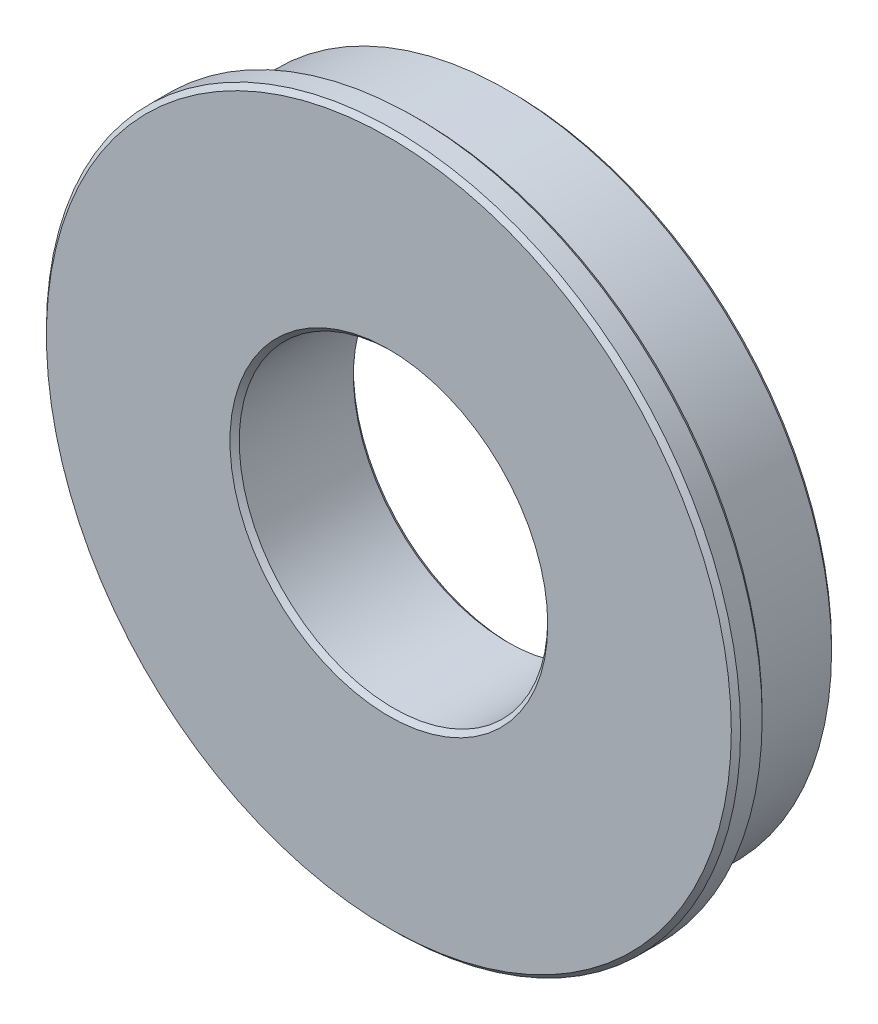
ISO-10303-21;
HEADER;
FILE_DESCRIPTION(('STEP AP214'),'2;1');
FILE_NAME('part.step','',(''),(''),'','','');
FILE_SCHEMA(('AUTOMOTIVE_DESIGN { 1 0 10303 214 1 1 1 1 }'));
ENDSEC;
DATA;
#1=APPLICATION_CONTEXT('core data for automotive mechanical design processes');
#2=APPLICATION_PROTOCOL_DEFINITION('international standard','automotive_design',2000,#1);
#3=PRODUCT_CONTEXT('',#1,'mechanical');
#4=PRODUCT('Part','Part','',(#3));
#5=PRODUCT_RELATED_PRODUCT_CATEGORY('part','',(#4));
#6=PRODUCT_DEFINITION_FORMATION('','',#4);
#7=PRODUCT_DEFINITION_CONTEXT('part definition',#1,'design');
#8=PRODUCT_DEFINITION('design','',#6,#7);
#9=PRODUCT_DEFINITION_SHAPE('','',#8);
#10=(LENGTH_UNIT() NAMED_UNIT(*) SI_UNIT(.MILLI.,.METRE.));
#11=(NAMED_UNIT(*) PLANE_ANGLE_UNIT() SI_UNIT($,.RADIAN.));
#12=(NAMED_UNIT(*) SI_UNIT($,.STERADIAN.) SOLID_ANGLE_UNIT());
#13=UNCERTAINTY_MEASURE_WITH_UNIT(LENGTH_MEASURE(1.E-05),#10,'distance_accuracy_value','');
#14=(GEOMETRIC_REPRESENTATION_CONTEXT(3) GLOBAL_UNCERTAINTY_ASSIGNED_CONTEXT((#13)) GLOBAL_UNIT_ASSIGNED_CONTEXT((#10,
#11,#12)) REPRESENTATION_CONTEXT('',''));
#15=CARTESIAN_POINT('',(0.,0.,0.));
#16=DIRECTION('',(0.,0.,1.));
#17=DIRECTION('',(1.,0.,0.));
#18=AXIS2_PLACEMENT_3D('',#15,#16,#17);
#19=CARTESIAN_POINT('',(0.,0.,4.));
#20=DIRECTION('',(0.,0.,-1.));
#21=DIRECTION('',(-1.,0.,0.));
#22=AXIS2_PLACEMENT_3D('',#19,#20,#21);
#23=CYLINDRICAL_SURFACE('',#22,21.);
#24=CARTESIAN_POINT('',(0.,0.,-3.69999999999998));
#25=DIRECTION('',(0.,0.,1.));
#26=DIRECTION('',(1.,0.,0.));
#27=AXIS2_PLACEMENT_3D('',#24,#25,#26);
#28=CIRCLE('',#27,21.);
#29=CARTESIAN_POINT('',(21.,0.,-3.69999999999998));
#30=VERTEX_POINT('',#29);
#31=EDGE_CURVE('E10',#30,#30,#28,.T.);
#32=ORIENTED_EDGE('',*,*,#31,.T.);
#33=EDGE_LOOP('',(#32));
#34=FACE_BOUND('',#33,.T.);
#35=CARTESIAN_POINT('',(0.,0.,2.));
#36=DIRECTION('',(0.,0.,1.));
#37=DIRECTION('',(1.,0.,0.));
#38=AXIS2_PLACEMENT_3D('',#35,#36,#37);
#39=CIRCLE('',#38,21.);
#40=CARTESIAN_POINT('',(21.,0.,2.));
#41=VERTEX_POINT('',#40);
#42=EDGE_CURVE('E72',#41,#41,#39,.T.);
#43=ORIENTED_EDGE('',*,*,#42,.F.);
#44=EDGE_LOOP('',(#43));
#45=FACE_BOUND('',#44,.T.);
#46=ADVANCED_FACE('F33',(#34,#45),#23,.T.);
#47=CARTESIAN_POINT('',(0.,0.,4.));
#48=DIRECTION('',(0.,0.,1.));
#49=DIRECTION('',(1.,0.,0.));
#50=AXIS2_PLACEMENT_3D('',#47,#48,#49);
#51=PLANE('',#50);
#52=CARTESIAN_POINT('',(0.,0.,4.));
#53=DIRECTION('',(0.,0.,1.));
#54=DIRECTION('',(1.,0.,0.));
#55=AXIS2_PLACEMENT_3D('',#52,#53,#54);
#56=CIRCLE('',#55,10.3);
#57=CARTESIAN_POINT('',(10.3,0.,4.));
#58=VERTEX_POINT('',#57);
#59=EDGE_CURVE('E60',#58,#58,#56,.F.);
#60=ORIENTED_EDGE('',*,*,#59,.T.);
#61=EDGE_LOOP('',(#60));
#62=FACE_BOUND('',#61,.T.);
#63=CARTESIAN_POINT('',(0.,0.,4.));
#64=DIRECTION('',(0.,0.,1.));
#65=DIRECTION('',(1.,0.,0.));
#66=AXIS2_PLACEMENT_3D('',#63,#64,#65);
#67=CIRCLE('',#66,22.2);
#68=CARTESIAN_POINT('',(22.2,0.,4.));
#69=VERTEX_POINT('',#68);
#70=EDGE_CURVE('E63',#69,#69,#67,.T.);
#71=ORIENTED_EDGE('',*,*,#70,.T.);
#72=EDGE_LOOP('',(#71));
#73=FACE_BOUND('',#72,.T.);
#74=ADVANCED_FACE('F79',(#62,#73),#51,.T.);
#75=CARTESIAN_POINT('',(0.,0.,-4.));
#76=DIRECTION('',(0.,0.,1.));
#77=DIRECTION('',(1.,0.,0.));
#78=AXIS2_PLACEMENT_3D('',#75,#76,#77);
#79=PLANE('',#78);
#80=CARTESIAN_POINT('',(0.,0.,-4.));
#81=DIRECTION('',(0.,0.,1.));
#82=DIRECTION('',(1.,0.,0.));
#83=AXIS2_PLACEMENT_3D('',#80,#81,#82);
#84=CIRCLE('',#83,10.3);
#85=CARTESIAN_POINT('',(10.3,0.,-4.));
#86=VERTEX_POINT('',#85);
#87=EDGE_CURVE('E41',#86,#86,#84,.T.);
#88=ORIENTED_EDGE('',*,*,#87,.T.);
#89=EDGE_LOOP('',(#88));
#90=FACE_BOUND('',#89,.T.);
#91=CARTESIAN_POINT('',(0.,0.,-4.));
#92=DIRECTION('',(0.,0.,1.));
#93=DIRECTION('',(1.,0.,0.));
#94=AXIS2_PLACEMENT_3D('',#91,#92,#93);
#95=CIRCLE('',#94,20.7);
#96=CARTESIAN_POINT('',(20.7,0.,-4.));
#97=VERTEX_POINT('',#96);
#98=EDGE_CURVE('E45',#97,#97,#95,.F.);
#99=ORIENTED_EDGE('',*,*,#98,.T.);
#100=EDGE_LOOP('',(#99));
#101=FACE_BOUND('',#100,.T.);
#102=ADVANCED_FACE('F84',(#90,#101),#79,.F.);
#103=CARTESIAN_POINT('',(0.,0.,4.));
#104=DIRECTION('',(0.,0.,-1.));
#105=DIRECTION('',(-1.,0.,0.));
#106=AXIS2_PLACEMENT_3D('',#103,#104,#105);
#107=CYLINDRICAL_SURFACE('',#106,10.);
#108=CARTESIAN_POINT('',(0.,0.,3.70000000000002));
#109=DIRECTION('',(0.,0.,1.));
#110=DIRECTION('',(1.,0.,0.));
#111=AXIS2_PLACEMENT_3D('',#108,#109,#110);
#112=CIRCLE('',#111,10.);
#113=CARTESIAN_POINT('',(10.,0.,3.70000000000002));
#114=VERTEX_POINT('',#113);
#115=EDGE_CURVE('E66',#114,#114,#112,.T.);
#116=ORIENTED_EDGE('',*,*,#115,.T.);
#117=EDGE_LOOP('',(#116));
#118=FACE_BOUND('',#117,.T.);
#119=CARTESIAN_POINT('',(0.,0.,-3.7));
#120=DIRECTION('',(0.,0.,1.));
#121=DIRECTION('',(1.,0.,0.));
#122=AXIS2_PLACEMENT_3D('',#119,#120,#121);
#123=CIRCLE('',#122,10.);
#124=CARTESIAN_POINT('',(10.,0.,-3.7));
#125=VERTEX_POINT('',#124);
#126=EDGE_CURVE('E69',#125,#125,#123,.F.);
#127=ORIENTED_EDGE('',*,*,#126,.T.);
#128=EDGE_LOOP('',(#127));
#129=FACE_BOUND('',#128,.T.);
#130=ADVANCED_FACE('F123',(#118,#129),#107,.F.);
#131=CARTESIAN_POINT('',(0.,0.,2.));
#132=DIRECTION('',(0.,0.,1.));
#133=DIRECTION('',(1.,0.,0.));
#134=AXIS2_PLACEMENT_3D('',#131,#132,#133);
#135=PLANE('',#134);
#136=CARTESIAN_POINT('',(0.,0.,2.));
#137=DIRECTION('',(0.,0.,1.));
#138=DIRECTION('',(1.,0.,0.));
#139=AXIS2_PLACEMENT_3D('',#136,#137,#138);
#140=CIRCLE('',#139,22.2);
#141=CARTESIAN_POINT('',(22.2,0.,2.));
#142=VERTEX_POINT('',#141);
#143=EDGE_CURVE('E49',#142,#142,#140,.F.);
#144=ORIENTED_EDGE('',*,*,#143,.T.);
#145=EDGE_LOOP('',(#144));
#146=FACE_BOUND('',#145,.T.);
#147=ORIENTED_EDGE('',*,*,#42,.T.);
#148=EDGE_LOOP('',(#147));
#149=FACE_BOUND('',#148,.T.);
#150=ADVANCED_FACE('F76',(#146,#149),#135,.F.);
#151=CARTESIAN_POINT('',(0.,0.,2.));
#152=DIRECTION('',(0.,0.,1.));
#153=DIRECTION('',(1.,0.,0.));
#154=AXIS2_PLACEMENT_3D('',#151,#152,#153);
#155=CYLINDRICAL_SURFACE('',#154,22.5);
#156=CARTESIAN_POINT('',(0.,0.,3.70000000000002));
#157=DIRECTION('',(0.,0.,1.));
#158=DIRECTION('',(1.,0.,0.));
#159=AXIS2_PLACEMENT_3D('',#156,#157,#158);
#160=CIRCLE('',#159,22.5);
#161=CARTESIAN_POINT('',(22.5,0.,3.70000000000002));
#162=VERTEX_POINT('',#161);
#163=EDGE_CURVE('E54',#162,#162,#160,.F.);
#164=ORIENTED_EDGE('',*,*,#163,.T.);
#165=EDGE_LOOP('',(#164));
#166=FACE_BOUND('',#165,.T.);
#167=CARTESIAN_POINT('',(0.,0.,2.29999999999998));
#168=DIRECTION('',(0.,0.,1.));
#169=DIRECTION('',(1.,0.,0.));
#170=AXIS2_PLACEMENT_3D('',#167,#168,#169);
#171=CIRCLE('',#170,22.5);
#172=CARTESIAN_POINT('',(22.5,0.,2.29999999999998));
#173=VERTEX_POINT('',#172);
#174=EDGE_CURVE('E57',#173,#173,#171,.T.);
#175=ORIENTED_EDGE('',*,*,#174,.T.);
#176=EDGE_LOOP('',(#175));
#177=FACE_BOUND('',#176,.T.);
#178=ADVANCED_FACE('F97',(#166,#177),#155,.T.);
#179=CARTESIAN_POINT('',(0.,0.,3.70000000000002));
#180=DIRECTION('',(0.,0.,1.));
#181=DIRECTION('',(1.,0.,0.));
#182=AXIS2_PLACEMENT_3D('',#179,#180,#181);
#183=CONICAL_SURFACE('',#182,10.,0.78539816339746);
#184=CARTESIAN_POINT('',(10.3,0.,4.));
#185=CARTESIAN_POINT('',(10.296875,0.,3.996875));
#186=CARTESIAN_POINT('',(10.29375,0.,3.99375));
#187=CARTESIAN_POINT('',(10.2875,0.,3.9875));
#188=CARTESIAN_POINT('',(10.284375,0.,3.984375));
#189=CARTESIAN_POINT('',(10.278125,0.,3.978125));
#190=CARTESIAN_POINT('',(10.275,0.,3.975));
#191=CARTESIAN_POINT('',(10.26875,0.,3.96875));
#192=CARTESIAN_POINT('',(10.265625,0.,3.965625));
#193=CARTESIAN_POINT('',(10.259375,0.,3.959375));
#194=CARTESIAN_POINT('',(10.25625,0.,3.95625));
#195=CARTESIAN_POINT('',(10.25,0.,3.95));
#196=CARTESIAN_POINT('',(10.246875,0.,3.946875));
#197=CARTESIAN_POINT('',(10.240625,0.,3.940625));
#198=CARTESIAN_POINT('',(10.2375,0.,3.9375));
#199=CARTESIAN_POINT('',(10.23125,0.,3.93125));
#200=CARTESIAN_POINT('',(10.228125,0.,3.928125));
#201=CARTESIAN_POINT('',(10.221875,0.,3.921875));
#202=CARTESIAN_POINT('',(10.21875,0.,3.91875));
#203=CARTESIAN_POINT('',(10.2125,0.,3.9125));
#204=CARTESIAN_POINT('',(10.209375,0.,3.909375));
#205=CARTESIAN_POINT('',(10.203125,0.,3.90312500000001));
#206=CARTESIAN_POINT('',(10.2,0.,3.90000000000001));
#207=CARTESIAN_POINT('',(10.19375,0.,3.89375000000001));
#208=CARTESIAN_POINT('',(10.190625,0.,3.89062500000001));
#209=CARTESIAN_POINT('',(10.184375,0.,3.88437500000001));
#210=CARTESIAN_POINT('',(10.18125,0.,3.88125000000001));
#211=CARTESIAN_POINT('',(10.175,0.,3.87500000000001));
#212=CARTESIAN_POINT('',(10.171875,0.,3.87187500000001));
#213=CARTESIAN_POINT('',(10.165625,0.,3.86562500000001));
#214=CARTESIAN_POINT('',(10.1625,0.,3.86250000000001));
#215=CARTESIAN_POINT('',(10.15625,0.,3.85625000000001));
#216=CARTESIAN_POINT('',(10.153125,0.,3.85312500000001));
#217=CARTESIAN_POINT('',(10.146875,0.,3.84687500000001));
#218=CARTESIAN_POINT('',(10.14375,0.,3.84375000000001));
#219=CARTESIAN_POINT('',(10.1375,0.,3.83750000000001));
#220=CARTESIAN_POINT('',(10.134375,0.,3.83437500000001));
#221=CARTESIAN_POINT('',(10.128125,0.,3.82812500000001));
#222=CARTESIAN_POINT('',(10.125,0.,3.82500000000001));
#223=CARTESIAN_POINT('',(10.11875,0.,3.81875000000001));
#224=CARTESIAN_POINT('',(10.115625,0.,3.81562500000001));
#225=CARTESIAN_POINT('',(10.109375,0.,3.80937500000001));
#226=CARTESIAN_POINT('',(10.10625,0.,3.80625000000001));
#227=CARTESIAN_POINT('',(10.1,0.,3.80000000000001));
#228=CARTESIAN_POINT('',(10.096875,0.,3.79687500000001));
#229=CARTESIAN_POINT('',(10.090625,0.,3.79062500000001));
#230=CARTESIAN_POINT('',(10.0875,0.,3.78750000000001));
#231=CARTESIAN_POINT('',(10.08125,0.,3.78125000000001));
#232=CARTESIAN_POINT('',(10.078125,0.,3.77812500000001));
#233=CARTESIAN_POINT('',(10.071875,0.,3.77187500000001));
#234=CARTESIAN_POINT('',(10.06875,0.,3.76875000000001));
#235=CARTESIAN_POINT('',(10.0625,0.,3.76250000000001));
#236=CARTESIAN_POINT('',(10.059375,0.,3.75937500000001));
#237=CARTESIAN_POINT('',(10.053125,0.,3.75312500000001));
#238=CARTESIAN_POINT('',(10.05,0.,3.75000000000001));
#239=CARTESIAN_POINT('',(10.04375,0.,3.74375000000001));
#240=CARTESIAN_POINT('',(10.040625,0.,3.74062500000002));
#241=CARTESIAN_POINT('',(10.034375,0.,3.73437500000002));
#242=CARTESIAN_POINT('',(10.03125,0.,3.73125000000002));
#243=CARTESIAN_POINT('',(10.025,0.,3.72500000000002));
#244=CARTESIAN_POINT('',(10.021875,0.,3.72187500000002));
#245=CARTESIAN_POINT('',(10.015625,0.,3.71562500000002));
#246=CARTESIAN_POINT('',(10.0125,0.,3.71250000000002));
#247=CARTESIAN_POINT('',(10.00625,0.,3.70625000000002));
#248=CARTESIAN_POINT('',(10.003125,0.,3.70312500000002));
#249=CARTESIAN_POINT('',(10.,0.,3.70000000000002));
#250=B_SPLINE_CURVE_WITH_KNOTS('',3,(#184,#185,#186,#187,#188,#189,#190,#191,#192,#193,#194,
#195,#196,#197,#198,#199,#200,#201,#202,#203,#204,#205,#206,#207,#208,#209,#210,#211,#212,#213,
#214,#215,#216,#217,#218,#219,#220,#221,#222,#223,#224,#225,#226,#227,#228,#229,#230,#231,#232,
#233,#234,#235,#236,#237,#238,#239,#240,#241,#242,#243,#244,#245,#246,#247,#248,#249),
.UNSPECIFIED.,.F.,.F.,(4,2,2,2,2,2,2,2,2,2,2,2,2,2,2,2,2,2,2,2,2,2,2,2,2,2,2,2,2,2,2,2,4),(0.,
0.0132582521472475,0.0265165042944944,0.0397747564417408,0.0530330085889889,0.0662912607362352,
0.0795495128834834,0.0928077650307297,0.106066017177977,0.119324269325225,0.132582521472471,
0.145840773619719,0.159099025766965,0.172357277914212,0.18561553006146,0.198873782208707,
0.212132034355955,0.225390286503201,0.238648538650449,0.251906790797696,0.265165042944942,
0.27842329509219,0.291681547239437,0.304939799386685,0.318198051533932,0.331456303681178,
0.344714555828426,0.357972807975673,0.37123106012292,0.384489312270167,0.397747564417414,
0.411005816564661,0.424264068711908),.UNSPECIFIED.);
#251=EDGE_CURVE('BSEAM90',#58,#114,#250,.T.);
#252=ORIENTED_EDGE('',*,*,#59,.F.);
#253=ORIENTED_EDGE('',*,*,#115,.F.);
#254=ORIENTED_EDGE('',*,*,#251,.T.);
#255=ORIENTED_EDGE('',*,*,#251,.F.);
#256=EDGE_LOOP('',(#252,#254,#253,#255));
#257=FACE_BOUND('',#256,.T.);
#258=ADVANCED_FACE('F90',(#257),#183,.F.);
#259=CARTESIAN_POINT('',(0.,0.,4.));
#260=DIRECTION('',(0.,0.,-1.));
#261=DIRECTION('',(-1.,0.,0.));
#262=AXIS2_PLACEMENT_3D('',#259,#260,#261);
#263=CONICAL_SURFACE('',#262,22.2,0.78539816339746);
#264=ORIENTED_EDGE('',*,*,#163,.F.);
#265=EDGE_LOOP('',(#264));
#266=FACE_BOUND('',#265,.T.);
#267=ORIENTED_EDGE('',*,*,#70,.F.);
#268=EDGE_LOOP('',(#267));
#269=FACE_BOUND('',#268,.T.);
#270=ADVANCED_FACE('F96',(#266,#269),#263,.T.);
#271=CARTESIAN_POINT('',(0.,0.,2.29999999999998));
#272=DIRECTION('',(0.,0.,1.));
#273=DIRECTION('',(1.,0.,0.));
#274=AXIS2_PLACEMENT_3D('',#271,#272,#273);
#275=CONICAL_SURFACE('',#274,22.5,0.785398163397454);
#276=ORIENTED_EDGE('',*,*,#143,.F.);
#277=EDGE_LOOP('',(#276));
#278=FACE_BOUND('',#277,.T.);
#279=ORIENTED_EDGE('',*,*,#174,.F.);
#280=EDGE_LOOP('',(#279));
#281=FACE_BOUND('',#280,.T.);
#282=ADVANCED_FACE('F104',(#278,#281),#275,.T.);
#283=CARTESIAN_POINT('',(0.,0.,-4.));
#284=DIRECTION('',(0.,0.,-1.));
#285=DIRECTION('',(-1.,0.,0.));
#286=AXIS2_PLACEMENT_3D('',#283,#284,#285);
#287=CONICAL_SURFACE('',#286,10.3,0.785398163397434);
#288=ORIENTED_EDGE('',*,*,#126,.F.);
#289=EDGE_LOOP('',(#288));
#290=FACE_BOUND('',#289,.T.);
#291=ORIENTED_EDGE('',*,*,#87,.F.);
#292=EDGE_LOOP('',(#291));
#293=FACE_BOUND('',#292,.T.);
#294=ADVANCED_FACE('F110',(#290,#293),#287,.F.);
#295=CARTESIAN_POINT('',(0.,0.,-3.69999999999998));
#296=DIRECTION('',(0.,0.,1.));
#297=DIRECTION('',(1.,0.,0.));
#298=AXIS2_PLACEMENT_3D('',#295,#296,#297);
#299=CONICAL_SURFACE('',#298,21.,0.785398163397437);
#300=ORIENTED_EDGE('',*,*,#98,.F.);
#301=EDGE_LOOP('',(#300));
#302=FACE_BOUND('',#301,.T.);
#303=ORIENTED_EDGE('',*,*,#31,.F.);
#304=EDGE_LOOP('',(#303));
#305=FACE_BOUND('',#304,.T.);
#306=ADVANCED_FACE('F36',(#302,#305),#299,.T.);
#307=CLOSED_SHELL('',(#46,#74,#102,#130,#150,#178,#258,#270,#282,#294,#306));
#308=MANIFOLD_SOLID_BREP('B2',#307);
#309=ADVANCED_BREP_SHAPE_REPRESENTATION('',(#18,#308),#14);
#310=SHAPE_DEFINITION_REPRESENTATION(#9,#309);
ENDSEC;
END-ISO-10303-21;
